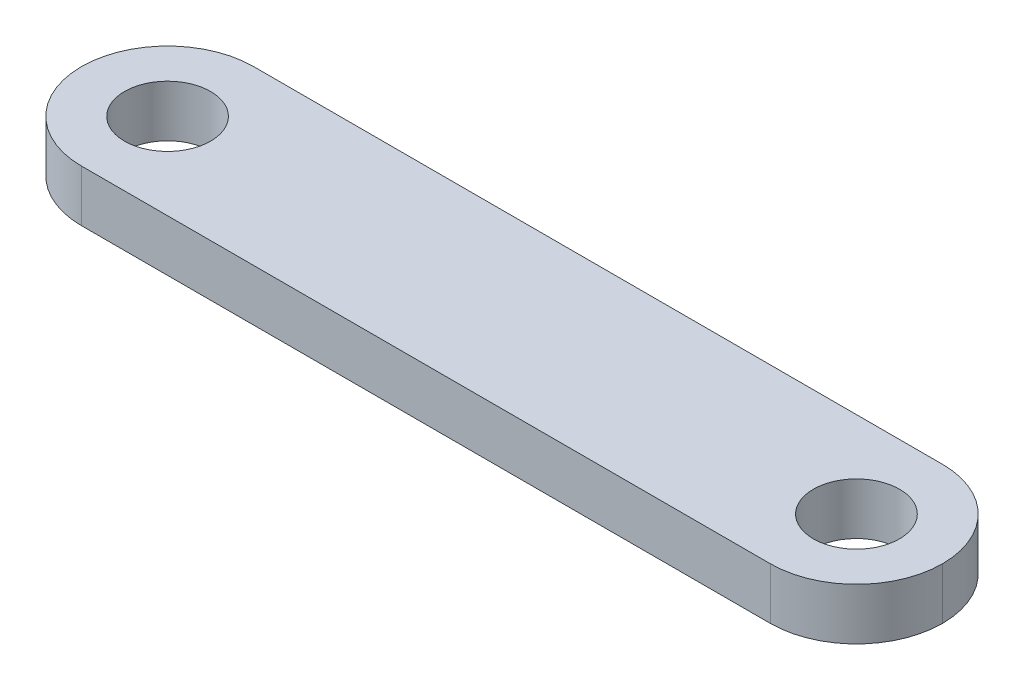
ISO-10303-21;
HEADER;
FILE_DESCRIPTION(('STEP AP214'),'2;1');
FILE_NAME('part.step','',(''),(''),'','','');
FILE_SCHEMA(('AUTOMOTIVE_DESIGN { 1 0 10303 214 1 1 1 1 }'));
ENDSEC;
DATA;
#1=APPLICATION_CONTEXT('core data for automotive mechanical design processes');
#2=APPLICATION_PROTOCOL_DEFINITION('international standard','automotive_design',2000,#1);
#3=PRODUCT_CONTEXT('',#1,'mechanical');
#4=PRODUCT('Part','Part','',(#3));
#5=PRODUCT_RELATED_PRODUCT_CATEGORY('part','',(#4));
#6=PRODUCT_DEFINITION_FORMATION('','',#4);
#7=PRODUCT_DEFINITION_CONTEXT('part definition',#1,'design');
#8=PRODUCT_DEFINITION('design','',#6,#7);
#9=PRODUCT_DEFINITION_SHAPE('','',#8);
#10=(LENGTH_UNIT() NAMED_UNIT(*) SI_UNIT(.MILLI.,.METRE.));
#11=(NAMED_UNIT(*) PLANE_ANGLE_UNIT() SI_UNIT($,.RADIAN.));
#12=(NAMED_UNIT(*) SI_UNIT($,.STERADIAN.) SOLID_ANGLE_UNIT());
#13=UNCERTAINTY_MEASURE_WITH_UNIT(LENGTH_MEASURE(1.E-05),#10,'distance_accuracy_value','');
#14=(GEOMETRIC_REPRESENTATION_CONTEXT(3) GLOBAL_UNCERTAINTY_ASSIGNED_CONTEXT((#13)) GLOBAL_UNIT_ASSIGNED_CONTEXT((#10,
#11,#12)) REPRESENTATION_CONTEXT('',''));
#15=CARTESIAN_POINT('',(0.,0.,0.));
#16=DIRECTION('',(0.,0.,1.));
#17=DIRECTION('',(1.,0.,0.));
#18=AXIS2_PLACEMENT_3D('',#15,#16,#17);
#19=CARTESIAN_POINT('',(0.,6.,0.));
#20=DIRECTION('',(0.,0.,-1.));
#21=DIRECTION('',(-1.,0.,0.));
#22=AXIS2_PLACEMENT_3D('',#19,#20,#21);
#23=PLANE('',#22);
#24=DIRECTION('',(1.,0.,0.));
#25=VECTOR('',#24,1.);
#26=CARTESIAN_POINT('',(0.,0.,0.));
#27=LINE('',#26,#25);
#28=CARTESIAN_POINT('',(10.,0.,0.));
#29=VERTEX_POINT('',#28);
#30=CARTESIAN_POINT('',(90.,0.,0.));
#31=VERTEX_POINT('',#30);
#32=EDGE_CURVE('E120',#29,#31,#27,.T.);
#33=ORIENTED_EDGE('',*,*,#32,.T.);
#34=DIRECTION('',(0.,-1.,0.));
#35=VECTOR('',#34,1.);
#36=CARTESIAN_POINT('',(90.,6.,0.));
#37=LINE('',#36,#35);
#38=CARTESIAN_POINT('',(90.,6.,0.));
#39=VERTEX_POINT('',#38);
#40=EDGE_CURVE('E11',#31,#39,#37,.F.);
#41=ORIENTED_EDGE('',*,*,#40,.T.);
#42=DIRECTION('',(1.,0.,0.));
#43=VECTOR('',#42,1.);
#44=CARTESIAN_POINT('',(0.,6.,0.));
#45=LINE('',#44,#43);
#46=CARTESIAN_POINT('',(10.,6.,0.));
#47=VERTEX_POINT('',#46);
#48=EDGE_CURVE('E119',#47,#39,#45,.T.);
#49=ORIENTED_EDGE('',*,*,#48,.F.);
#50=DIRECTION('',(0.,-1.,0.));
#51=VECTOR('',#50,1.);
#52=CARTESIAN_POINT('',(10.,6.,0.));
#53=LINE('',#52,#51);
#54=EDGE_CURVE('E46',#47,#29,#53,.T.);
#55=ORIENTED_EDGE('',*,*,#54,.T.);
#56=EDGE_LOOP('',(#33,#41,#49,#55));
#57=FACE_BOUND('',#56,.T.);
#58=ADVANCED_FACE('F37',(#57),#23,.F.);
#59=CARTESIAN_POINT('',(0.,6.,-20.));
#60=DIRECTION('',(0.,0.,1.));
#61=DIRECTION('',(1.,0.,0.));
#62=AXIS2_PLACEMENT_3D('',#59,#60,#61);
#63=PLANE('',#62);
#64=DIRECTION('',(-1.,0.,0.));
#65=VECTOR('',#64,1.);
#66=CARTESIAN_POINT('',(0.,6.,-20.));
#67=LINE('',#66,#65);
#68=CARTESIAN_POINT('',(90.,6.,-20.));
#69=VERTEX_POINT('',#68);
#70=CARTESIAN_POINT('',(10.,6.,-20.));
#71=VERTEX_POINT('',#70);
#72=EDGE_CURVE('E112',#69,#71,#67,.T.);
#73=ORIENTED_EDGE('',*,*,#72,.F.);
#74=DIRECTION('',(0.,-1.,0.));
#75=VECTOR('',#74,1.);
#76=CARTESIAN_POINT('',(90.,6.,-20.));
#77=LINE('',#76,#75);
#78=CARTESIAN_POINT('',(90.,0.,-20.));
#79=VERTEX_POINT('',#78);
#80=EDGE_CURVE('E96',#69,#79,#77,.T.);
#81=ORIENTED_EDGE('',*,*,#80,.T.);
#82=DIRECTION('',(-1.,0.,0.));
#83=VECTOR('',#82,1.);
#84=CARTESIAN_POINT('',(0.,0.,-20.));
#85=LINE('',#84,#83);
#86=CARTESIAN_POINT('',(10.,0.,-20.));
#87=VERTEX_POINT('',#86);
#88=EDGE_CURVE('E109',#79,#87,#85,.T.);
#89=ORIENTED_EDGE('',*,*,#88,.T.);
#90=DIRECTION('',(0.,-1.,0.));
#91=VECTOR('',#90,1.);
#92=CARTESIAN_POINT('',(10.,6.,-20.));
#93=LINE('',#92,#91);
#94=EDGE_CURVE('E114',#87,#71,#93,.F.);
#95=ORIENTED_EDGE('',*,*,#94,.T.);
#96=EDGE_LOOP('',(#73,#81,#89,#95));
#97=FACE_BOUND('',#96,.T.);
#98=ADVANCED_FACE('F107',(#97),#63,.F.);
#99=CARTESIAN_POINT('',(0.,6.,0.));
#100=DIRECTION('',(0.,-1.,0.));
#101=DIRECTION('',(0.,0.,-1.));
#102=AXIS2_PLACEMENT_3D('',#99,#100,#101);
#103=PLANE('',#102);
#104=CARTESIAN_POINT('',(10.,6.,-10.));
#105=DIRECTION('',(0.,1.,0.));
#106=DIRECTION('',(0.,0.,1.));
#107=AXIS2_PLACEMENT_3D('',#104,#105,#106);
#108=CIRCLE('',#107,5.);
#109=CARTESIAN_POINT('',(10.,6.,-5.));
#110=VERTEX_POINT('',#109);
#111=EDGE_CURVE('E141',#110,#110,#108,.T.);
#112=ORIENTED_EDGE('',*,*,#111,.F.);
#113=EDGE_LOOP('',(#112));
#114=FACE_BOUND('',#113,.T.);
#115=CARTESIAN_POINT('',(90.,6.,-10.));
#116=DIRECTION('',(0.,1.,0.));
#117=DIRECTION('',(0.,0.,1.));
#118=AXIS2_PLACEMENT_3D('',#115,#116,#117);
#119=CIRCLE('',#118,5.);
#120=CARTESIAN_POINT('',(90.,6.,-5.));
#121=VERTEX_POINT('',#120);
#122=EDGE_CURVE('E146',#121,#121,#119,.T.);
#123=ORIENTED_EDGE('',*,*,#122,.F.);
#124=EDGE_LOOP('',(#123));
#125=FACE_BOUND('',#124,.T.);
#126=CARTESIAN_POINT('',(90.,6.,-10.));
#127=DIRECTION('',(0.,-1.,0.));
#128=DIRECTION('',(0.,0.,-1.));
#129=AXIS2_PLACEMENT_3D('',#126,#127,#128);
#130=CIRCLE('',#129,10.);
#131=CARTESIAN_POINT('',(100.,6.,-10.));
#132=VERTEX_POINT('',#131);
#133=EDGE_CURVE('E54',#39,#132,#130,.F.);
#134=ORIENTED_EDGE('',*,*,#133,.T.);
#135=CARTESIAN_POINT('',(90.,6.,-10.));
#136=DIRECTION('',(0.,-1.,0.));
#137=DIRECTION('',(0.,0.,-1.));
#138=AXIS2_PLACEMENT_3D('',#135,#136,#137);
#139=CIRCLE('',#138,10.);
#140=EDGE_CURVE('E134',#132,#69,#139,.F.);
#141=ORIENTED_EDGE('',*,*,#140,.T.);
#142=ORIENTED_EDGE('',*,*,#72,.T.);
#143=CARTESIAN_POINT('',(10.,6.,-10.));
#144=DIRECTION('',(0.,-1.,0.));
#145=DIRECTION('',(0.,0.,-1.));
#146=AXIS2_PLACEMENT_3D('',#143,#144,#145);
#147=CIRCLE('',#146,10.);
#148=CARTESIAN_POINT('',(0.,6.,-10.));
#149=VERTEX_POINT('',#148);
#150=EDGE_CURVE('E131',#71,#149,#147,.F.);
#151=ORIENTED_EDGE('',*,*,#150,.T.);
#152=CARTESIAN_POINT('',(10.,6.,-10.));
#153=DIRECTION('',(0.,-1.,0.));
#154=DIRECTION('',(0.,0.,-1.));
#155=AXIS2_PLACEMENT_3D('',#152,#153,#154);
#156=CIRCLE('',#155,10.);
#157=EDGE_CURVE('E101',#149,#47,#156,.F.);
#158=ORIENTED_EDGE('',*,*,#157,.T.);
#159=ORIENTED_EDGE('',*,*,#48,.T.);
#160=EDGE_LOOP('',(#134,#141,#142,#151,#158,#159));
#161=FACE_BOUND('',#160,.T.);
#162=ADVANCED_FACE('F153',(#114,#125,#161),#103,.F.);
#163=CARTESIAN_POINT('',(0.,0.,0.));
#164=DIRECTION('',(0.,-1.,0.));
#165=DIRECTION('',(0.,0.,-1.));
#166=AXIS2_PLACEMENT_3D('',#163,#164,#165);
#167=PLANE('',#166);
#168=CARTESIAN_POINT('',(10.,0.,-10.));
#169=DIRECTION('',(0.,1.,0.));
#170=DIRECTION('',(0.,0.,1.));
#171=AXIS2_PLACEMENT_3D('',#168,#169,#170);
#172=CIRCLE('',#171,5.);
#173=CARTESIAN_POINT('',(10.,0.,-5.));
#174=VERTEX_POINT('',#173);
#175=EDGE_CURVE('E137',#174,#174,#172,.T.);
#176=ORIENTED_EDGE('',*,*,#175,.T.);
#177=EDGE_LOOP('',(#176));
#178=FACE_BOUND('',#177,.T.);
#179=CARTESIAN_POINT('',(90.,0.,-10.));
#180=DIRECTION('',(0.,1.,0.));
#181=DIRECTION('',(0.,0.,1.));
#182=AXIS2_PLACEMENT_3D('',#179,#180,#181);
#183=CIRCLE('',#182,5.);
#184=CARTESIAN_POINT('',(90.,0.,-5.));
#185=VERTEX_POINT('',#184);
#186=EDGE_CURVE('E151',#185,#185,#183,.T.);
#187=ORIENTED_EDGE('',*,*,#186,.T.);
#188=EDGE_LOOP('',(#187));
#189=FACE_BOUND('',#188,.T.);
#190=ORIENTED_EDGE('',*,*,#88,.F.);
#191=CARTESIAN_POINT('',(90.,0.,-10.));
#192=DIRECTION('',(0.,-1.,0.));
#193=DIRECTION('',(0.,0.,-1.));
#194=AXIS2_PLACEMENT_3D('',#191,#192,#193);
#195=CIRCLE('',#194,10.);
#196=CARTESIAN_POINT('',(100.,0.,-10.));
#197=VERTEX_POINT('',#196);
#198=EDGE_CURVE('E92',#79,#197,#195,.T.);
#199=ORIENTED_EDGE('',*,*,#198,.T.);
#200=CARTESIAN_POINT('',(90.,0.,-10.));
#201=DIRECTION('',(0.,-1.,0.));
#202=DIRECTION('',(0.,0.,-1.));
#203=AXIS2_PLACEMENT_3D('',#200,#201,#202);
#204=CIRCLE('',#203,10.);
#205=EDGE_CURVE('E102',#197,#31,#204,.T.);
#206=ORIENTED_EDGE('',*,*,#205,.T.);
#207=ORIENTED_EDGE('',*,*,#32,.F.);
#208=CARTESIAN_POINT('',(10.,0.,-10.));
#209=DIRECTION('',(0.,-1.,0.));
#210=DIRECTION('',(0.,0.,-1.));
#211=AXIS2_PLACEMENT_3D('',#208,#209,#210);
#212=CIRCLE('',#211,10.);
#213=CARTESIAN_POINT('',(0.,0.,-10.));
#214=VERTEX_POINT('',#213);
#215=EDGE_CURVE('E113',#29,#214,#212,.T.);
#216=ORIENTED_EDGE('',*,*,#215,.T.);
#217=CARTESIAN_POINT('',(10.,0.,-10.));
#218=DIRECTION('',(0.,-1.,0.));
#219=DIRECTION('',(0.,0.,-1.));
#220=AXIS2_PLACEMENT_3D('',#217,#218,#219);
#221=CIRCLE('',#220,10.);
#222=EDGE_CURVE('E118',#214,#87,#221,.T.);
#223=ORIENTED_EDGE('',*,*,#222,.T.);
#224=EDGE_LOOP('',(#190,#199,#206,#207,#216,#223));
#225=FACE_BOUND('',#224,.T.);
#226=ADVANCED_FACE('F116',(#178,#189,#225),#167,.T.);
#227=CARTESIAN_POINT('',(90.,6.,-10.));
#228=DIRECTION('',(0.,-1.,0.));
#229=DIRECTION('',(0.,0.,-1.));
#230=AXIS2_PLACEMENT_3D('',#227,#228,#229);
#231=CYLINDRICAL_SURFACE('',#230,10.);
#232=DIRECTION('',(0.,-1.,0.));
#233=VECTOR('',#232,1.);
#234=CARTESIAN_POINT('',(100.,6.,-10.));
#235=LINE('',#234,#233);
#236=EDGE_CURVE('E97',#132,#197,#235,.T.);
#237=ORIENTED_EDGE('',*,*,#236,.F.);
#238=ORIENTED_EDGE('',*,*,#133,.F.);
#239=ORIENTED_EDGE('',*,*,#40,.F.);
#240=ORIENTED_EDGE('',*,*,#205,.F.);
#241=EDGE_LOOP('',(#237,#238,#239,#240));
#242=FACE_BOUND('',#241,.T.);
#243=ADVANCED_FACE('F160',(#242),#231,.T.);
#244=CARTESIAN_POINT('',(90.,6.,-10.));
#245=DIRECTION('',(0.,-1.,0.));
#246=DIRECTION('',(0.,0.,-1.));
#247=AXIS2_PLACEMENT_3D('',#244,#245,#246);
#248=CYLINDRICAL_SURFACE('',#247,10.);
#249=ORIENTED_EDGE('',*,*,#140,.F.);
#250=ORIENTED_EDGE('',*,*,#236,.T.);
#251=ORIENTED_EDGE('',*,*,#198,.F.);
#252=ORIENTED_EDGE('',*,*,#80,.F.);
#253=EDGE_LOOP('',(#249,#250,#251,#252));
#254=FACE_BOUND('',#253,.T.);
#255=ADVANCED_FACE('F95',(#254),#248,.T.);
#256=CARTESIAN_POINT('',(10.,6.,-10.));
#257=DIRECTION('',(0.,-1.,0.));
#258=DIRECTION('',(0.,0.,-1.));
#259=AXIS2_PLACEMENT_3D('',#256,#257,#258);
#260=CYLINDRICAL_SURFACE('',#259,10.);
#261=ORIENTED_EDGE('',*,*,#54,.F.);
#262=ORIENTED_EDGE('',*,*,#157,.F.);
#263=DIRECTION('',(0.,-1.,0.));
#264=VECTOR('',#263,1.);
#265=CARTESIAN_POINT('',(0.,6.,-10.));
#266=LINE('',#265,#264);
#267=EDGE_CURVE('E41',#214,#149,#266,.F.);
#268=ORIENTED_EDGE('',*,*,#267,.F.);
#269=ORIENTED_EDGE('',*,*,#215,.F.);
#270=EDGE_LOOP('',(#261,#262,#268,#269));
#271=FACE_BOUND('',#270,.T.);
#272=ADVANCED_FACE('F39',(#271),#260,.T.);
#273=CARTESIAN_POINT('',(10.,6.,-10.));
#274=DIRECTION('',(0.,-1.,0.));
#275=DIRECTION('',(0.,0.,-1.));
#276=AXIS2_PLACEMENT_3D('',#273,#274,#275);
#277=CYLINDRICAL_SURFACE('',#276,10.);
#278=ORIENTED_EDGE('',*,*,#150,.F.);
#279=ORIENTED_EDGE('',*,*,#94,.F.);
#280=ORIENTED_EDGE('',*,*,#222,.F.);
#281=ORIENTED_EDGE('',*,*,#267,.T.);
#282=EDGE_LOOP('',(#278,#279,#280,#281));
#283=FACE_BOUND('',#282,.T.);
#284=ADVANCED_FACE('F183',(#283),#277,.T.);
#285=CARTESIAN_POINT('',(90.,0.,-10.));
#286=DIRECTION('',(0.,1.,0.));
#287=DIRECTION('',(0.,0.,1.));
#288=AXIS2_PLACEMENT_3D('',#285,#286,#287);
#289=CYLINDRICAL_SURFACE('',#288,5.);
#290=ORIENTED_EDGE('',*,*,#186,.F.);
#291=EDGE_LOOP('',(#290));
#292=FACE_BOUND('',#291,.T.);
#293=ORIENTED_EDGE('',*,*,#122,.T.);
#294=EDGE_LOOP('',(#293));
#295=FACE_BOUND('',#294,.T.);
#296=ADVANCED_FACE('F179',(#292,#295),#289,.F.);
#297=CARTESIAN_POINT('',(10.,0.,-10.));
#298=DIRECTION('',(0.,1.,0.));
#299=DIRECTION('',(0.,0.,1.));
#300=AXIS2_PLACEMENT_3D('',#297,#298,#299);
#301=CYLINDRICAL_SURFACE('',#300,5.);
#302=ORIENTED_EDGE('',*,*,#175,.F.);
#303=EDGE_LOOP('',(#302));
#304=FACE_BOUND('',#303,.T.);
#305=ORIENTED_EDGE('',*,*,#111,.T.);
#306=EDGE_LOOP('',(#305));
#307=FACE_BOUND('',#306,.T.);
#308=ADVANCED_FACE('F182',(#304,#307),#301,.F.);
#309=CLOSED_SHELL('',(#58,#98,#162,#226,#243,#255,#272,#284,#296,#308));
#310=MANIFOLD_SOLID_BREP('B2',#309);
#311=ADVANCED_BREP_SHAPE_REPRESENTATION('',(#18,#310),#14);
#312=SHAPE_DEFINITION_REPRESENTATION(#9,#311);
ENDSEC;
END-ISO-10303-21;
